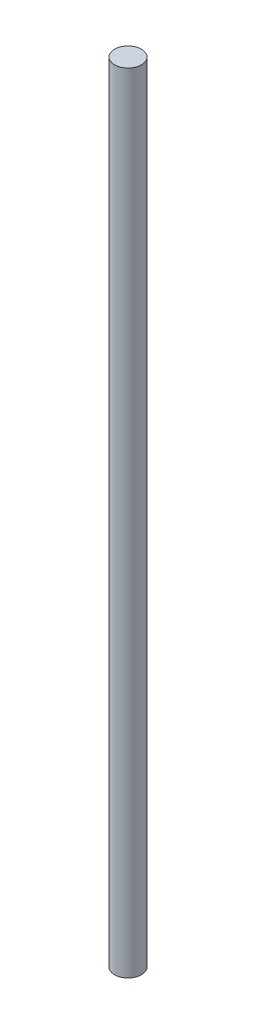
ISO-10303-21;
HEADER;
FILE_DESCRIPTION(('STEP AP214'),'2;1');
FILE_NAME('part.step','',(''),(''),'','','');
FILE_SCHEMA(('AUTOMOTIVE_DESIGN { 1 0 10303 214 1 1 1 1 }'));
ENDSEC;
DATA;
#1=APPLICATION_CONTEXT('core data for automotive mechanical design processes');
#2=APPLICATION_PROTOCOL_DEFINITION('international standard','automotive_design',2000,#1);
#3=PRODUCT_CONTEXT('',#1,'mechanical');
#4=PRODUCT('Part','Part','',(#3));
#5=PRODUCT_RELATED_PRODUCT_CATEGORY('part','',(#4));
#6=PRODUCT_DEFINITION_FORMATION('','',#4);
#7=PRODUCT_DEFINITION_CONTEXT('part definition',#1,'design');
#8=PRODUCT_DEFINITION('design','',#6,#7);
#9=PRODUCT_DEFINITION_SHAPE('','',#8);
#10=(LENGTH_UNIT() NAMED_UNIT(*) SI_UNIT(.MILLI.,.METRE.));
#11=(NAMED_UNIT(*) PLANE_ANGLE_UNIT() SI_UNIT($,.RADIAN.));
#12=(NAMED_UNIT(*) SI_UNIT($,.STERADIAN.) SOLID_ANGLE_UNIT());
#13=UNCERTAINTY_MEASURE_WITH_UNIT(LENGTH_MEASURE(1.E-05),#10,'distance_accuracy_value','');
#14=(GEOMETRIC_REPRESENTATION_CONTEXT(3) GLOBAL_UNCERTAINTY_ASSIGNED_CONTEXT((#13)) GLOBAL_UNIT_ASSIGNED_CONTEXT((#10,
#11,#12)) REPRESENTATION_CONTEXT('',''));
#15=CARTESIAN_POINT('',(0.,0.,0.));
#16=DIRECTION('',(0.,0.,1.));
#17=DIRECTION('',(1.,0.,0.));
#18=AXIS2_PLACEMENT_3D('',#15,#16,#17);
#19=CARTESIAN_POINT('',(0.,38.,0.));
#20=DIRECTION('',(0.,-1.,0.));
#21=DIRECTION('',(0.,0.,-1.));
#22=AXIS2_PLACEMENT_3D('',#19,#20,#21);
#23=CYLINDRICAL_SURFACE('',#22,0.65);
#24=CARTESIAN_POINT('',(0.,38.,0.));
#25=DIRECTION('',(0.,1.,0.));
#26=DIRECTION('',(0.,0.,1.));
#27=AXIS2_PLACEMENT_3D('',#24,#25,#26);
#28=CIRCLE('',#27,0.65);
#29=CARTESIAN_POINT('',(0.,38.,0.65));
#30=VERTEX_POINT('',#29);
#31=EDGE_CURVE('E10',#30,#30,#28,.T.);
#32=ORIENTED_EDGE('',*,*,#31,.F.);
#33=EDGE_LOOP('',(#32));
#34=FACE_BOUND('',#33,.T.);
#35=CARTESIAN_POINT('',(0.,0.,0.));
#36=DIRECTION('',(0.,1.,0.));
#37=DIRECTION('',(0.,0.,1.));
#38=AXIS2_PLACEMENT_3D('',#35,#36,#37);
#39=CIRCLE('',#38,0.65);
#40=CARTESIAN_POINT('',(0.,0.,0.65));
#41=VERTEX_POINT('',#40);
#42=EDGE_CURVE('E32',#41,#41,#39,.T.);
#43=ORIENTED_EDGE('',*,*,#42,.T.);
#44=EDGE_LOOP('',(#43));
#45=FACE_BOUND('',#44,.T.);
#46=ADVANCED_FACE('F29',(#34,#45),#23,.T.);
#47=CARTESIAN_POINT('',(0.,38.,0.));
#48=DIRECTION('',(0.,1.,0.));
#49=DIRECTION('',(0.,0.,1.));
#50=AXIS2_PLACEMENT_3D('',#47,#48,#49);
#51=PLANE('',#50);
#52=ORIENTED_EDGE('',*,*,#31,.T.);
#53=EDGE_LOOP('',(#52));
#54=FACE_BOUND('',#53,.T.);
#55=ADVANCED_FACE('F44',(#54),#51,.T.);
#56=CARTESIAN_POINT('',(0.,0.,0.));
#57=DIRECTION('',(0.,1.,0.));
#58=DIRECTION('',(0.,0.,1.));
#59=AXIS2_PLACEMENT_3D('',#56,#57,#58);
#60=PLANE('',#59);
#61=ORIENTED_EDGE('',*,*,#42,.F.);
#62=EDGE_LOOP('',(#61));
#63=FACE_BOUND('',#62,.T.);
#64=ADVANCED_FACE('F42',(#63),#60,.F.);
#65=CLOSED_SHELL('',(#46,#55,#64));
#66=MANIFOLD_SOLID_BREP('B2',#65);
#67=ADVANCED_BREP_SHAPE_REPRESENTATION('',(#18,#66),#14);
#68=SHAPE_DEFINITION_REPRESENTATION(#9,#67);
ENDSEC;
END-ISO-10303-21;
